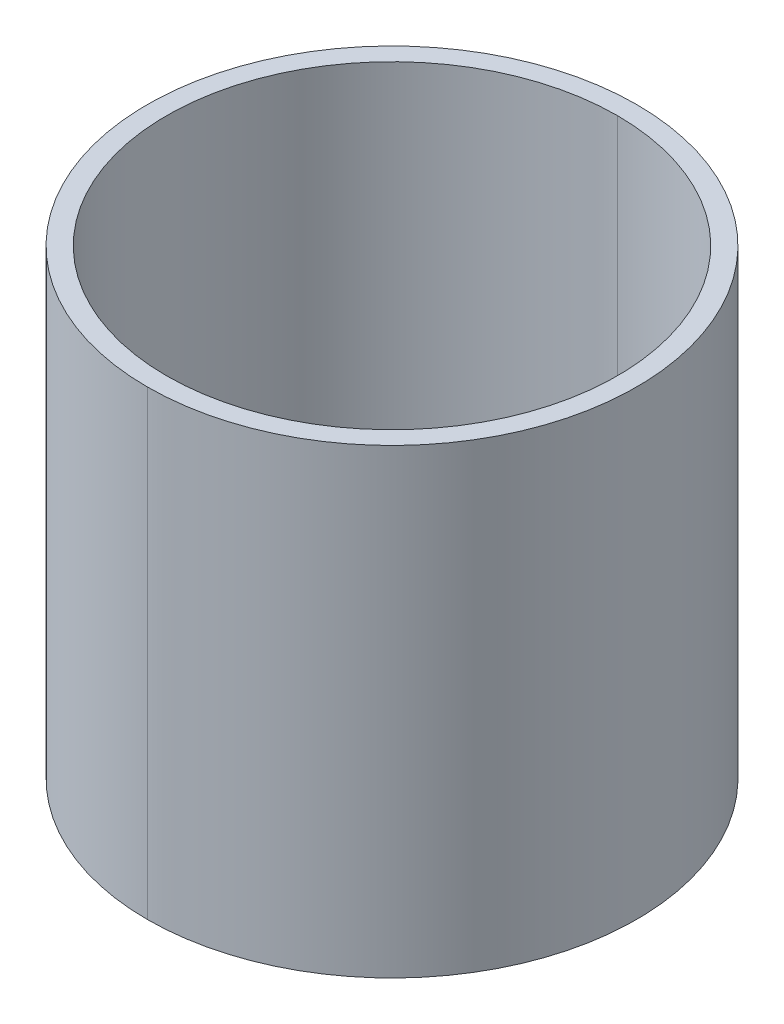
ISO-10303-21;
HEADER;
FILE_DESCRIPTION(('STEP AP214'),'2;1');
FILE_NAME('part.step','',(''),(''),'','','');
FILE_SCHEMA(('AUTOMOTIVE_DESIGN { 1 0 10303 214 1 1 1 1 }'));
ENDSEC;
DATA;
#1=APPLICATION_CONTEXT('core data for automotive mechanical design processes');
#2=APPLICATION_PROTOCOL_DEFINITION('international standard','automotive_design',2000,#1);
#3=PRODUCT_CONTEXT('',#1,'mechanical');
#4=PRODUCT('Part','Part','',(#3));
#5=PRODUCT_RELATED_PRODUCT_CATEGORY('part','',(#4));
#6=PRODUCT_DEFINITION_FORMATION('','',#4);
#7=PRODUCT_DEFINITION_CONTEXT('part definition',#1,'design');
#8=PRODUCT_DEFINITION('design','',#6,#7);
#9=PRODUCT_DEFINITION_SHAPE('','',#8);
#10=(LENGTH_UNIT() NAMED_UNIT(*) SI_UNIT(.MILLI.,.METRE.));
#11=(NAMED_UNIT(*) PLANE_ANGLE_UNIT() SI_UNIT($,.RADIAN.));
#12=(NAMED_UNIT(*) SI_UNIT($,.STERADIAN.) SOLID_ANGLE_UNIT());
#13=UNCERTAINTY_MEASURE_WITH_UNIT(LENGTH_MEASURE(1.E-05),#10,'distance_accuracy_value','');
#14=(GEOMETRIC_REPRESENTATION_CONTEXT(3) GLOBAL_UNCERTAINTY_ASSIGNED_CONTEXT((#13)) GLOBAL_UNIT_ASSIGNED_CONTEXT((#10,
#11,#12)) REPRESENTATION_CONTEXT('',''));
#15=CARTESIAN_POINT('',(0.,0.,0.));
#16=DIRECTION('',(0.,0.,1.));
#17=DIRECTION('',(1.,0.,0.));
#18=AXIS2_PLACEMENT_3D('',#15,#16,#17);
#19=CARTESIAN_POINT('',(7.747,14.605,0.));
#20=DIRECTION('',(0.,1.,0.));
#21=DIRECTION('',(0.,0.,1.));
#22=AXIS2_PLACEMENT_3D('',#19,#20,#21);
#23=PLANE('',#22);
#24=CARTESIAN_POINT('',(0.,14.605,0.));
#25=DIRECTION('',(0.,-1.,0.));
#26=DIRECTION('',(0.,0.,-1.));
#27=AXIS2_PLACEMENT_3D('',#24,#25,#26);
#28=CIRCLE('',#27,7.1374);
#29=CARTESIAN_POINT('',(0.,14.605,-7.1374));
#30=VERTEX_POINT('',#29);
#31=CARTESIAN_POINT('',(0.,14.605,7.1374));
#32=VERTEX_POINT('',#31);
#33=EDGE_CURVE('E11',#30,#32,#28,.T.);
#34=ORIENTED_EDGE('',*,*,#33,.T.);
#35=CARTESIAN_POINT('',(0.,14.605,0.));
#36=DIRECTION('',(0.,-1.,0.));
#37=DIRECTION('',(0.,0.,-1.));
#38=AXIS2_PLACEMENT_3D('',#35,#36,#37);
#39=CIRCLE('',#38,7.1374);
#40=EDGE_CURVE('E24',#32,#30,#39,.T.);
#41=ORIENTED_EDGE('',*,*,#40,.T.);
#42=EDGE_LOOP('',(#34,#41));
#43=FACE_BOUND('',#42,.T.);
#44=CARTESIAN_POINT('',(0.,14.605,0.));
#45=DIRECTION('',(0.,-1.,0.));
#46=DIRECTION('',(0.,0.,-1.));
#47=AXIS2_PLACEMENT_3D('',#44,#45,#46);
#48=CIRCLE('',#47,7.747);
#49=CARTESIAN_POINT('',(0.,14.605,7.747));
#50=VERTEX_POINT('',#49);
#51=CARTESIAN_POINT('',(0.,14.605,-7.747));
#52=VERTEX_POINT('',#51);
#53=EDGE_CURVE('E94',#50,#52,#48,.T.);
#54=ORIENTED_EDGE('',*,*,#53,.F.);
#55=CARTESIAN_POINT('',(0.,14.605,0.));
#56=DIRECTION('',(0.,-1.,0.));
#57=DIRECTION('',(0.,0.,-1.));
#58=AXIS2_PLACEMENT_3D('',#55,#56,#57);
#59=CIRCLE('',#58,7.747);
#60=EDGE_CURVE('E89',#52,#50,#59,.T.);
#61=ORIENTED_EDGE('',*,*,#60,.F.);
#62=EDGE_LOOP('',(#54,#61));
#63=FACE_BOUND('',#62,.T.);
#64=ADVANCED_FACE('F16',(#43,#63),#23,.T.);
#65=CARTESIAN_POINT('',(0.,0.,0.));
#66=DIRECTION('',(0.,-1.,0.));
#67=DIRECTION('',(-1.,0.,0.));
#68=AXIS2_PLACEMENT_3D('',#65,#66,#67);
#69=CYLINDRICAL_SURFACE('',#68,7.747);
#70=DIRECTION('',(0.,-1.,0.));
#71=VECTOR('',#70,1.);
#72=CARTESIAN_POINT('',(0.,14.605,7.747));
#73=LINE('',#72,#71);
#74=CARTESIAN_POINT('',(0.,0.,7.747));
#75=VERTEX_POINT('',#74);
#76=EDGE_CURVE('E85',#50,#75,#73,.T.);
#77=ORIENTED_EDGE('',*,*,#76,.T.);
#78=CARTESIAN_POINT('',(0.,0.,0.));
#79=DIRECTION('',(0.,-1.,0.));
#80=DIRECTION('',(0.,0.,-1.));
#81=AXIS2_PLACEMENT_3D('',#78,#79,#80);
#82=CIRCLE('',#81,7.747);
#83=CARTESIAN_POINT('',(0.,0.,-7.747));
#84=VERTEX_POINT('',#83);
#85=EDGE_CURVE('E80',#84,#75,#82,.T.);
#86=ORIENTED_EDGE('',*,*,#85,.F.);
#87=DIRECTION('',(0.,-1.,0.));
#88=VECTOR('',#87,1.);
#89=CARTESIAN_POINT('',(0.,14.605,-7.747));
#90=LINE('',#89,#88);
#91=EDGE_CURVE('E69',#52,#84,#90,.T.);
#92=ORIENTED_EDGE('',*,*,#91,.F.);
#93=ORIENTED_EDGE('',*,*,#60,.T.);
#94=EDGE_LOOP('',(#77,#86,#92,#93));
#95=FACE_BOUND('',#94,.T.);
#96=ADVANCED_FACE('F110',(#95),#69,.T.);
#97=CARTESIAN_POINT('',(0.,0.,0.));
#98=DIRECTION('',(0.,-1.,0.));
#99=DIRECTION('',(1.,0.,0.));
#100=AXIS2_PLACEMENT_3D('',#97,#98,#99);
#101=CYLINDRICAL_SURFACE('',#100,7.747);
#102=ORIENTED_EDGE('',*,*,#76,.F.);
#103=ORIENTED_EDGE('',*,*,#53,.T.);
#104=ORIENTED_EDGE('',*,*,#91,.T.);
#105=CARTESIAN_POINT('',(0.,0.,0.));
#106=DIRECTION('',(0.,-1.,0.));
#107=DIRECTION('',(0.,0.,-1.));
#108=AXIS2_PLACEMENT_3D('',#105,#106,#107);
#109=CIRCLE('',#108,7.747);
#110=EDGE_CURVE('E66',#75,#84,#109,.T.);
#111=ORIENTED_EDGE('',*,*,#110,.F.);
#112=EDGE_LOOP('',(#102,#103,#104,#111));
#113=FACE_BOUND('',#112,.T.);
#114=ADVANCED_FACE('F105',(#113),#101,.T.);
#115=CARTESIAN_POINT('',(7.1374,0.,0.));
#116=DIRECTION('',(0.,-1.,0.));
#117=DIRECTION('',(0.,0.,-1.));
#118=AXIS2_PLACEMENT_3D('',#115,#116,#117);
#119=PLANE('',#118);
#120=ORIENTED_EDGE('',*,*,#85,.T.);
#121=ORIENTED_EDGE('',*,*,#110,.T.);
#122=EDGE_LOOP('',(#120,#121));
#123=FACE_BOUND('',#122,.T.);
#124=CARTESIAN_POINT('',(0.,0.,0.));
#125=DIRECTION('',(0.,-1.,0.));
#126=DIRECTION('',(0.,0.,-1.));
#127=AXIS2_PLACEMENT_3D('',#124,#125,#126);
#128=CIRCLE('',#127,7.1374);
#129=CARTESIAN_POINT('',(0.,0.,7.1374));
#130=VERTEX_POINT('',#129);
#131=CARTESIAN_POINT('',(0.,0.,-7.1374));
#132=VERTEX_POINT('',#131);
#133=EDGE_CURVE('E54',#130,#132,#128,.T.);
#134=ORIENTED_EDGE('',*,*,#133,.F.);
#135=CARTESIAN_POINT('',(0.,0.,0.));
#136=DIRECTION('',(0.,-1.,0.));
#137=DIRECTION('',(0.,0.,-1.));
#138=AXIS2_PLACEMENT_3D('',#135,#136,#137);
#139=CIRCLE('',#138,7.1374);
#140=EDGE_CURVE('E50',#132,#130,#139,.T.);
#141=ORIENTED_EDGE('',*,*,#140,.F.);
#142=EDGE_LOOP('',(#134,#141));
#143=FACE_BOUND('',#142,.T.);
#144=ADVANCED_FACE('F52',(#123,#143),#119,.T.);
#145=CARTESIAN_POINT('',(0.,0.,0.));
#146=DIRECTION('',(0.,-1.,0.));
#147=DIRECTION('',(-1.,0.,0.));
#148=AXIS2_PLACEMENT_3D('',#145,#146,#147);
#149=CYLINDRICAL_SURFACE('',#148,7.1374);
#150=DIRECTION('',(0.,-1.,0.));
#151=VECTOR('',#150,1.);
#152=CARTESIAN_POINT('',(0.,14.605,7.1374));
#153=LINE('',#152,#151);
#154=EDGE_CURVE('E58',#32,#130,#153,.T.);
#155=ORIENTED_EDGE('',*,*,#154,.F.);
#156=ORIENTED_EDGE('',*,*,#33,.F.);
#157=DIRECTION('',(0.,-1.,0.));
#158=VECTOR('',#157,1.);
#159=CARTESIAN_POINT('',(0.,14.605,-7.1374));
#160=LINE('',#159,#158);
#161=EDGE_CURVE('E61',#30,#132,#160,.T.);
#162=ORIENTED_EDGE('',*,*,#161,.T.);
#163=ORIENTED_EDGE('',*,*,#140,.T.);
#164=EDGE_LOOP('',(#155,#156,#162,#163));
#165=FACE_BOUND('',#164,.T.);
#166=ADVANCED_FACE('F62',(#165),#149,.F.);
#167=CARTESIAN_POINT('',(0.,0.,0.));
#168=DIRECTION('',(0.,-1.,0.));
#169=DIRECTION('',(1.,0.,0.));
#170=AXIS2_PLACEMENT_3D('',#167,#168,#169);
#171=CYLINDRICAL_SURFACE('',#170,7.1374);
#172=ORIENTED_EDGE('',*,*,#154,.T.);
#173=ORIENTED_EDGE('',*,*,#133,.T.);
#174=ORIENTED_EDGE('',*,*,#161,.F.);
#175=ORIENTED_EDGE('',*,*,#40,.F.);
#176=EDGE_LOOP('',(#172,#173,#174,#175));
#177=FACE_BOUND('',#176,.T.);
#178=ADVANCED_FACE('F65',(#177),#171,.F.);
#179=CLOSED_SHELL('',(#64,#96,#114,#144,#166,#178));
#180=MANIFOLD_SOLID_BREP('B1',#179);
#181=ADVANCED_BREP_SHAPE_REPRESENTATION('',(#18,#180),#14);
#182=SHAPE_DEFINITION_REPRESENTATION(#9,#181);
ENDSEC;
END-ISO-10303-21;
